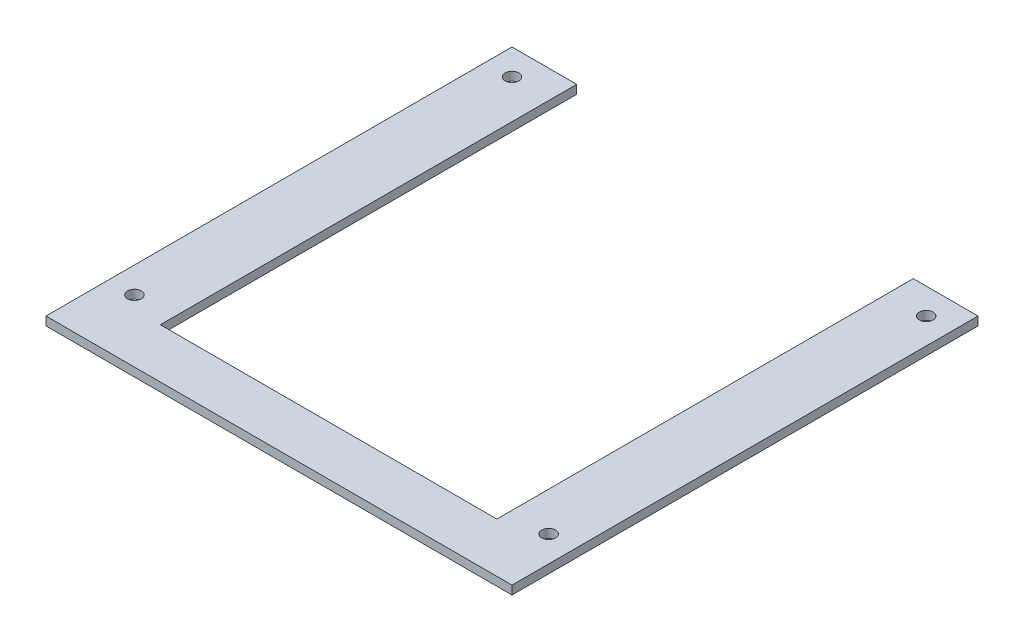
ISO-10303-21;
HEADER;
FILE_DESCRIPTION(('STEP AP214'),'2;1');
FILE_NAME('part.step','',(''),(''),'','','');
FILE_SCHEMA(('AUTOMOTIVE_DESIGN { 1 0 10303 214 1 1 1 1 }'));
ENDSEC;
DATA;
#1=APPLICATION_CONTEXT('core data for automotive mechanical design processes');
#2=APPLICATION_PROTOCOL_DEFINITION('international standard','automotive_design',2000,#1);
#3=PRODUCT_CONTEXT('',#1,'mechanical');
#4=PRODUCT('Part','Part','',(#3));
#5=PRODUCT_RELATED_PRODUCT_CATEGORY('part','',(#4));
#6=PRODUCT_DEFINITION_FORMATION('','',#4);
#7=PRODUCT_DEFINITION_CONTEXT('part definition',#1,'design');
#8=PRODUCT_DEFINITION('design','',#6,#7);
#9=PRODUCT_DEFINITION_SHAPE('','',#8);
#10=(LENGTH_UNIT() NAMED_UNIT(*) SI_UNIT(.MILLI.,.METRE.));
#11=(NAMED_UNIT(*) PLANE_ANGLE_UNIT() SI_UNIT($,.RADIAN.));
#12=(NAMED_UNIT(*) SI_UNIT($,.STERADIAN.) SOLID_ANGLE_UNIT());
#13=UNCERTAINTY_MEASURE_WITH_UNIT(LENGTH_MEASURE(1.E-05),#10,'distance_accuracy_value','');
#14=(GEOMETRIC_REPRESENTATION_CONTEXT(3) GLOBAL_UNCERTAINTY_ASSIGNED_CONTEXT((#13)) GLOBAL_UNIT_ASSIGNED_CONTEXT((#10,
#11,#12)) REPRESENTATION_CONTEXT('',''));
#15=CARTESIAN_POINT('',(0.,0.,0.));
#16=DIRECTION('',(0.,0.,1.));
#17=DIRECTION('',(1.,0.,0.));
#18=AXIS2_PLACEMENT_3D('',#15,#16,#17);
#19=CARTESIAN_POINT('',(-57.0170777988615,2.,-35.7039848197343));
#20=DIRECTION('',(0.,0.,1.));
#21=DIRECTION('',(1.,0.,0.));
#22=AXIS2_PLACEMENT_3D('',#19,#20,#21);
#23=PLANE('',#22);
#24=DIRECTION('',(-1.,0.,0.));
#25=VECTOR('',#24,1.);
#26=CARTESIAN_POINT('',(-57.0170777988615,2.,-35.7039848197343));
#27=LINE('',#26,#25);
#28=CARTESIAN_POINT('',(-42.0170777988615,2.,-35.7039848197343));
#29=VERTEX_POINT('',#28);
#30=CARTESIAN_POINT('',(-57.0170777988615,2.,-35.7039848197343));
#31=VERTEX_POINT('',#30);
#32=EDGE_CURVE('E64',#29,#31,#27,.T.);
#33=ORIENTED_EDGE('',*,*,#32,.F.);
#34=DIRECTION('',(0.,1.,0.));
#35=VECTOR('',#34,1.);
#36=CARTESIAN_POINT('',(-42.0170777988615,0.,-35.7039848197343));
#37=LINE('',#36,#35);
#38=CARTESIAN_POINT('',(-42.0170777988615,0.,-35.7039848197343));
#39=VERTEX_POINT('',#38);
#40=EDGE_CURVE('E151',#39,#29,#37,.T.);
#41=ORIENTED_EDGE('',*,*,#40,.F.);
#42=DIRECTION('',(-1.,0.,0.));
#43=VECTOR('',#42,1.);
#44=CARTESIAN_POINT('',(-57.0170777988615,0.,-35.7039848197343));
#45=LINE('',#44,#43);
#46=CARTESIAN_POINT('',(-57.0170777988615,0.,-35.7039848197343));
#47=VERTEX_POINT('',#46);
#48=EDGE_CURVE('E86',#39,#47,#45,.T.);
#49=ORIENTED_EDGE('',*,*,#48,.T.);
#50=DIRECTION('',(0.,-1.,0.));
#51=VECTOR('',#50,1.);
#52=CARTESIAN_POINT('',(-57.0170777988615,2.,-35.7039848197343));
#53=LINE('',#52,#51);
#54=EDGE_CURVE('E174',#31,#47,#53,.T.);
#55=ORIENTED_EDGE('',*,*,#54,.F.);
#56=EDGE_LOOP('',(#33,#41,#49,#55));
#57=FACE_BOUND('',#56,.T.);
#58=ADVANCED_FACE('F39',(#57),#23,.F.);
#59=CARTESIAN_POINT('',(-57.0170777988615,2.,-35.7039848197343));
#60=DIRECTION('',(1.,0.,0.));
#61=DIRECTION('',(0.,0.,-1.));
#62=AXIS2_PLACEMENT_3D('',#59,#60,#61);
#63=PLANE('',#62);
#64=DIRECTION('',(0.,0.,1.));
#65=VECTOR('',#64,1.);
#66=CARTESIAN_POINT('',(-57.0170777988615,0.,-35.7039848197343));
#67=LINE('',#66,#65);
#68=CARTESIAN_POINT('',(-57.0170777988615,0.,72.2960151802657));
#69=VERTEX_POINT('',#68);
#70=EDGE_CURVE('E154',#47,#69,#67,.T.);
#71=ORIENTED_EDGE('',*,*,#70,.T.);
#72=DIRECTION('',(0.,-1.,0.));
#73=VECTOR('',#72,1.);
#74=CARTESIAN_POINT('',(-57.0170777988615,2.,72.2960151802657));
#75=LINE('',#74,#73);
#76=CARTESIAN_POINT('',(-57.0170777988615,2.,72.2960151802657));
#77=VERTEX_POINT('',#76);
#78=EDGE_CURVE('E11',#77,#69,#75,.T.);
#79=ORIENTED_EDGE('',*,*,#78,.F.);
#80=DIRECTION('',(0.,0.,1.));
#81=VECTOR('',#80,1.);
#82=CARTESIAN_POINT('',(-57.0170777988615,2.,-35.7039848197343));
#83=LINE('',#82,#81);
#84=EDGE_CURVE('E161',#31,#77,#83,.T.);
#85=ORIENTED_EDGE('',*,*,#84,.F.);
#86=ORIENTED_EDGE('',*,*,#54,.T.);
#87=EDGE_LOOP('',(#71,#79,#85,#86));
#88=FACE_BOUND('',#87,.T.);
#89=ADVANCED_FACE('F41',(#88),#63,.F.);
#90=CARTESIAN_POINT('',(-57.0170777988615,2.,72.2960151802657));
#91=DIRECTION('',(0.,0.,-1.));
#92=DIRECTION('',(-1.,0.,0.));
#93=AXIS2_PLACEMENT_3D('',#90,#91,#92);
#94=PLANE('',#93);
#95=DIRECTION('',(1.,0.,0.));
#96=VECTOR('',#95,1.);
#97=CARTESIAN_POINT('',(-57.0170777988615,0.,72.2960151802657));
#98=LINE('',#97,#96);
#99=CARTESIAN_POINT('',(50.9829222011385,0.,72.2960151802657));
#100=VERTEX_POINT('',#99);
#101=EDGE_CURVE('E178',#69,#100,#98,.T.);
#102=ORIENTED_EDGE('',*,*,#101,.T.);
#103=DIRECTION('',(0.,-1.,0.));
#104=VECTOR('',#103,1.);
#105=CARTESIAN_POINT('',(50.9829222011385,2.,72.2960151802657));
#106=LINE('',#105,#104);
#107=CARTESIAN_POINT('',(50.9829222011385,2.,72.2960151802657));
#108=VERTEX_POINT('',#107);
#109=EDGE_CURVE('E48',#108,#100,#106,.T.);
#110=ORIENTED_EDGE('',*,*,#109,.F.);
#111=DIRECTION('',(1.,0.,0.));
#112=VECTOR('',#111,1.);
#113=CARTESIAN_POINT('',(-57.0170777988615,2.,72.2960151802657));
#114=LINE('',#113,#112);
#115=EDGE_CURVE('E93',#77,#108,#114,.T.);
#116=ORIENTED_EDGE('',*,*,#115,.F.);
#117=ORIENTED_EDGE('',*,*,#78,.T.);
#118=EDGE_LOOP('',(#102,#110,#116,#117));
#119=FACE_BOUND('',#118,.T.);
#120=ADVANCED_FACE('F208',(#119),#94,.F.);
#121=CARTESIAN_POINT('',(50.9829222011385,2.,-35.7039848197343));
#122=DIRECTION('',(-1.,0.,0.));
#123=DIRECTION('',(0.,0.,1.));
#124=AXIS2_PLACEMENT_3D('',#121,#122,#123);
#125=PLANE('',#124);
#126=DIRECTION('',(0.,0.,-1.));
#127=VECTOR('',#126,1.);
#128=CARTESIAN_POINT('',(50.9829222011385,0.,-35.7039848197343));
#129=LINE('',#128,#127);
#130=CARTESIAN_POINT('',(50.9829222011385,0.,-35.7039848197343));
#131=VERTEX_POINT('',#130);
#132=EDGE_CURVE('E181',#100,#131,#129,.T.);
#133=ORIENTED_EDGE('',*,*,#132,.T.);
#134=DIRECTION('',(0.,-1.,0.));
#135=VECTOR('',#134,1.);
#136=CARTESIAN_POINT('',(50.9829222011385,2.,-35.7039848197343));
#137=LINE('',#136,#135);
#138=CARTESIAN_POINT('',(50.9829222011385,2.,-35.7039848197343));
#139=VERTEX_POINT('',#138);
#140=EDGE_CURVE('E189',#139,#131,#137,.T.);
#141=ORIENTED_EDGE('',*,*,#140,.F.);
#142=DIRECTION('',(0.,0.,-1.));
#143=VECTOR('',#142,1.);
#144=CARTESIAN_POINT('',(50.9829222011385,2.,-35.7039848197343));
#145=LINE('',#144,#143);
#146=EDGE_CURVE('E167',#108,#139,#145,.T.);
#147=ORIENTED_EDGE('',*,*,#146,.F.);
#148=ORIENTED_EDGE('',*,*,#109,.T.);
#149=EDGE_LOOP('',(#133,#141,#147,#148));
#150=FACE_BOUND('',#149,.T.);
#151=ADVANCED_FACE('F197',(#150),#125,.F.);
#152=CARTESIAN_POINT('',(35.9829222011385,0.,-35.7039848197343));
#153=VERTEX_POINT('',#152);
#154=EDGE_CURVE('E164',#131,#153,#45,.T.);
#155=ORIENTED_EDGE('',*,*,#154,.T.);
#156=DIRECTION('',(0.,1.,0.));
#157=VECTOR('',#156,1.);
#158=CARTESIAN_POINT('',(35.9829222011385,0.,-35.7039848197343));
#159=LINE('',#158,#157);
#160=CARTESIAN_POINT('',(35.9829222011385,2.,-35.7039848197343));
#161=VERTEX_POINT('',#160);
#162=EDGE_CURVE('E155',#153,#161,#159,.T.);
#163=ORIENTED_EDGE('',*,*,#162,.T.);
#164=EDGE_CURVE('E170',#139,#161,#27,.T.);
#165=ORIENTED_EDGE('',*,*,#164,.F.);
#166=ORIENTED_EDGE('',*,*,#140,.T.);
#167=EDGE_LOOP('',(#155,#163,#165,#166));
#168=FACE_BOUND('',#167,.T.);
#169=ADVANCED_FACE('F201',(#168),#23,.F.);
#170=CARTESIAN_POINT('',(0.,2.,0.));
#171=DIRECTION('',(0.,1.,0.));
#172=DIRECTION('',(0.,0.,1.));
#173=AXIS2_PLACEMENT_3D('',#170,#171,#172);
#174=PLANE('',#173);
#175=CARTESIAN_POINT('',(44.9829222011386,2.,57.7960151802657));
#176=DIRECTION('',(0.,1.,0.));
#177=DIRECTION('',(0.,0.,1.));
#178=AXIS2_PLACEMENT_3D('',#175,#176,#177);
#179=CIRCLE('',#178,1.6);
#180=CARTESIAN_POINT('',(44.9829222011386,2.,59.3960151802657));
#181=VERTEX_POINT('',#180);
#182=EDGE_CURVE('E141',#181,#181,#179,.T.);
#183=ORIENTED_EDGE('',*,*,#182,.F.);
#184=EDGE_LOOP('',(#183));
#185=FACE_BOUND('',#184,.T.);
#186=CARTESIAN_POINT('',(-51.0170777988615,2.,57.7960151802657));
#187=DIRECTION('',(0.,1.,0.));
#188=DIRECTION('',(0.,0.,1.));
#189=AXIS2_PLACEMENT_3D('',#186,#187,#188);
#190=CIRCLE('',#189,1.6);
#191=CARTESIAN_POINT('',(-51.0170777988615,2.,59.3960151802657));
#192=VERTEX_POINT('',#191);
#193=EDGE_CURVE('E281',#192,#192,#190,.T.);
#194=ORIENTED_EDGE('',*,*,#193,.F.);
#195=EDGE_LOOP('',(#194));
#196=FACE_BOUND('',#195,.T.);
#197=CARTESIAN_POINT('',(44.9829222011386,2.,-29.7039848197343));
#198=DIRECTION('',(0.,1.,0.));
#199=DIRECTION('',(0.,0.,1.));
#200=AXIS2_PLACEMENT_3D('',#197,#198,#199);
#201=CIRCLE('',#200,1.6);
#202=CARTESIAN_POINT('',(44.9829222011386,2.,-28.1039848197343));
#203=VERTEX_POINT('',#202);
#204=EDGE_CURVE('E271',#203,#203,#201,.T.);
#205=ORIENTED_EDGE('',*,*,#204,.F.);
#206=EDGE_LOOP('',(#205));
#207=FACE_BOUND('',#206,.T.);
#208=CARTESIAN_POINT('',(-51.0170777988615,2.,-29.7039848197343));
#209=DIRECTION('',(0.,1.,0.));
#210=DIRECTION('',(0.,0.,1.));
#211=AXIS2_PLACEMENT_3D('',#208,#209,#210);
#212=CIRCLE('',#211,1.6);
#213=CARTESIAN_POINT('',(-51.0170777988615,2.,-28.1039848197343));
#214=VERTEX_POINT('',#213);
#215=EDGE_CURVE('E262',#214,#214,#212,.T.);
#216=ORIENTED_EDGE('',*,*,#215,.F.);
#217=EDGE_LOOP('',(#216));
#218=FACE_BOUND('',#217,.T.);
#219=DIRECTION('',(0.,0.,1.));
#220=VECTOR('',#219,1.);
#221=CARTESIAN_POINT('',(-42.0170777988615,2.,-35.7039848197343));
#222=LINE('',#221,#220);
#223=CARTESIAN_POINT('',(-42.0170777988615,2.,60.7960151802657));
#224=VERTEX_POINT('',#223);
#225=EDGE_CURVE('E119',#29,#224,#222,.T.);
#226=ORIENTED_EDGE('',*,*,#225,.F.);
#227=ORIENTED_EDGE('',*,*,#32,.T.);
#228=ORIENTED_EDGE('',*,*,#84,.T.);
#229=ORIENTED_EDGE('',*,*,#115,.T.);
#230=ORIENTED_EDGE('',*,*,#146,.T.);
#231=ORIENTED_EDGE('',*,*,#164,.T.);
#232=DIRECTION('',(0.,0.,-1.));
#233=VECTOR('',#232,1.);
#234=CARTESIAN_POINT('',(35.9829222011385,2.,-35.7039848197343));
#235=LINE('',#234,#233);
#236=CARTESIAN_POINT('',(35.9829222011385,2.,60.7960151802657));
#237=VERTEX_POINT('',#236);
#238=EDGE_CURVE('E135',#237,#161,#235,.T.);
#239=ORIENTED_EDGE('',*,*,#238,.F.);
#240=DIRECTION('',(1.,0.,0.));
#241=VECTOR('',#240,1.);
#242=CARTESIAN_POINT('',(-42.0170777988615,2.,60.7960151802657));
#243=LINE('',#242,#241);
#244=EDGE_CURVE('E138',#224,#237,#243,.T.);
#245=ORIENTED_EDGE('',*,*,#244,.F.);
#246=EDGE_LOOP('',(#226,#227,#228,#229,#230,#231,#239,#245));
#247=FACE_BOUND('',#246,.T.);
#248=ADVANCED_FACE('F204',(#185,#196,#207,#218,#247),#174,.T.);
#249=CARTESIAN_POINT('',(0.,0.,0.));
#250=DIRECTION('',(0.,1.,0.));
#251=DIRECTION('',(0.,0.,1.));
#252=AXIS2_PLACEMENT_3D('',#249,#250,#251);
#253=PLANE('',#252);
#254=CARTESIAN_POINT('',(44.9829222011386,0.,57.7960151802657));
#255=DIRECTION('',(0.,1.,0.));
#256=DIRECTION('',(0.,0.,1.));
#257=AXIS2_PLACEMENT_3D('',#254,#255,#256);
#258=CIRCLE('',#257,1.6);
#259=CARTESIAN_POINT('',(44.9829222011386,0.,59.3960151802657));
#260=VERTEX_POINT('',#259);
#261=EDGE_CURVE('E284',#260,#260,#258,.T.);
#262=ORIENTED_EDGE('',*,*,#261,.T.);
#263=EDGE_LOOP('',(#262));
#264=FACE_BOUND('',#263,.T.);
#265=CARTESIAN_POINT('',(-51.0170777988615,0.,57.7960151802657));
#266=DIRECTION('',(0.,1.,0.));
#267=DIRECTION('',(0.,0.,1.));
#268=AXIS2_PLACEMENT_3D('',#265,#266,#267);
#269=CIRCLE('',#268,1.6);
#270=CARTESIAN_POINT('',(-51.0170777988615,0.,59.3960151802657));
#271=VERTEX_POINT('',#270);
#272=EDGE_CURVE('E277',#271,#271,#269,.T.);
#273=ORIENTED_EDGE('',*,*,#272,.T.);
#274=EDGE_LOOP('',(#273));
#275=FACE_BOUND('',#274,.T.);
#276=CARTESIAN_POINT('',(44.9829222011386,0.,-29.7039848197343));
#277=DIRECTION('',(0.,1.,0.));
#278=DIRECTION('',(0.,0.,1.));
#279=AXIS2_PLACEMENT_3D('',#276,#277,#278);
#280=CIRCLE('',#279,1.6);
#281=CARTESIAN_POINT('',(44.9829222011386,0.,-28.1039848197343));
#282=VERTEX_POINT('',#281);
#283=EDGE_CURVE('E265',#282,#282,#280,.T.);
#284=ORIENTED_EDGE('',*,*,#283,.T.);
#285=EDGE_LOOP('',(#284));
#286=FACE_BOUND('',#285,.T.);
#287=CARTESIAN_POINT('',(-51.0170777988615,0.,-29.7039848197343));
#288=DIRECTION('',(0.,1.,0.));
#289=DIRECTION('',(0.,0.,1.));
#290=AXIS2_PLACEMENT_3D('',#287,#288,#289);
#291=CIRCLE('',#290,1.6);
#292=CARTESIAN_POINT('',(-51.0170777988615,0.,-28.1039848197343));
#293=VERTEX_POINT('',#292);
#294=EDGE_CURVE('E148',#293,#293,#291,.T.);
#295=ORIENTED_EDGE('',*,*,#294,.T.);
#296=EDGE_LOOP('',(#295));
#297=FACE_BOUND('',#296,.T.);
#298=ORIENTED_EDGE('',*,*,#48,.F.);
#299=DIRECTION('',(0.,0.,1.));
#300=VECTOR('',#299,1.);
#301=CARTESIAN_POINT('',(-42.0170777988615,0.,-35.7039848197343));
#302=LINE('',#301,#300);
#303=CARTESIAN_POINT('',(-42.0170777988615,0.,60.7960151802657));
#304=VERTEX_POINT('',#303);
#305=EDGE_CURVE('E118',#39,#304,#302,.T.);
#306=ORIENTED_EDGE('',*,*,#305,.T.);
#307=DIRECTION('',(1.,0.,0.));
#308=VECTOR('',#307,1.);
#309=CARTESIAN_POINT('',(-42.0170777988615,0.,60.7960151802657));
#310=LINE('',#309,#308);
#311=CARTESIAN_POINT('',(35.9829222011385,0.,60.7960151802657));
#312=VERTEX_POINT('',#311);
#313=EDGE_CURVE('E127',#304,#312,#310,.T.);
#314=ORIENTED_EDGE('',*,*,#313,.T.);
#315=DIRECTION('',(0.,0.,-1.));
#316=VECTOR('',#315,1.);
#317=CARTESIAN_POINT('',(35.9829222011385,0.,-35.7039848197343));
#318=LINE('',#317,#316);
#319=EDGE_CURVE('E55',#312,#153,#318,.T.);
#320=ORIENTED_EDGE('',*,*,#319,.T.);
#321=ORIENTED_EDGE('',*,*,#154,.F.);
#322=ORIENTED_EDGE('',*,*,#132,.F.);
#323=ORIENTED_EDGE('',*,*,#101,.F.);
#324=ORIENTED_EDGE('',*,*,#70,.F.);
#325=EDGE_LOOP('',(#298,#306,#314,#320,#321,#322,#323,#324));
#326=FACE_BOUND('',#325,.T.);
#327=ADVANCED_FACE('F132',(#264,#275,#286,#297,#326),#253,.F.);
#328=CARTESIAN_POINT('',(-42.0170777988615,0.,-35.7039848197343));
#329=DIRECTION('',(-1.,0.,0.));
#330=DIRECTION('',(0.,0.,1.));
#331=AXIS2_PLACEMENT_3D('',#328,#329,#330);
#332=PLANE('',#331);
#333=ORIENTED_EDGE('',*,*,#225,.T.);
#334=DIRECTION('',(0.,1.,0.));
#335=VECTOR('',#334,1.);
#336=CARTESIAN_POINT('',(-42.0170777988615,0.,60.7960151802657));
#337=LINE('',#336,#335);
#338=EDGE_CURVE('E114',#304,#224,#337,.T.);
#339=ORIENTED_EDGE('',*,*,#338,.F.);
#340=ORIENTED_EDGE('',*,*,#305,.F.);
#341=ORIENTED_EDGE('',*,*,#40,.T.);
#342=EDGE_LOOP('',(#333,#339,#340,#341));
#343=FACE_BOUND('',#342,.T.);
#344=ADVANCED_FACE('F116',(#343),#332,.F.);
#345=CARTESIAN_POINT('',(35.9829222011385,0.,-35.7039848197343));
#346=DIRECTION('',(1.,0.,0.));
#347=DIRECTION('',(0.,0.,-1.));
#348=AXIS2_PLACEMENT_3D('',#345,#346,#347);
#349=PLANE('',#348);
#350=ORIENTED_EDGE('',*,*,#238,.T.);
#351=ORIENTED_EDGE('',*,*,#162,.F.);
#352=ORIENTED_EDGE('',*,*,#319,.F.);
#353=DIRECTION('',(0.,1.,0.));
#354=VECTOR('',#353,1.);
#355=CARTESIAN_POINT('',(35.9829222011385,0.,60.7960151802657));
#356=LINE('',#355,#354);
#357=EDGE_CURVE('E124',#312,#237,#356,.T.);
#358=ORIENTED_EDGE('',*,*,#357,.T.);
#359=EDGE_LOOP('',(#350,#351,#352,#358));
#360=FACE_BOUND('',#359,.T.);
#361=ADVANCED_FACE('F235',(#360),#349,.F.);
#362=CARTESIAN_POINT('',(-42.0170777988615,0.,60.7960151802657));
#363=DIRECTION('',(0.,0.,1.));
#364=DIRECTION('',(1.,0.,0.));
#365=AXIS2_PLACEMENT_3D('',#362,#363,#364);
#366=PLANE('',#365);
#367=ORIENTED_EDGE('',*,*,#244,.T.);
#368=ORIENTED_EDGE('',*,*,#357,.F.);
#369=ORIENTED_EDGE('',*,*,#313,.F.);
#370=ORIENTED_EDGE('',*,*,#338,.T.);
#371=EDGE_LOOP('',(#367,#368,#369,#370));
#372=FACE_BOUND('',#371,.T.);
#373=ADVANCED_FACE('F128',(#372),#366,.F.);
#374=CARTESIAN_POINT('',(-51.0170777988615,0.,-29.7039848197343));
#375=DIRECTION('',(0.,1.,0.));
#376=DIRECTION('',(0.,0.,1.));
#377=AXIS2_PLACEMENT_3D('',#374,#375,#376);
#378=CYLINDRICAL_SURFACE('',#377,1.6);
#379=ORIENTED_EDGE('',*,*,#294,.F.);
#380=EDGE_LOOP('',(#379));
#381=FACE_BOUND('',#380,.T.);
#382=ORIENTED_EDGE('',*,*,#215,.T.);
#383=EDGE_LOOP('',(#382));
#384=FACE_BOUND('',#383,.T.);
#385=ADVANCED_FACE('F238',(#381,#384),#378,.F.);
#386=CARTESIAN_POINT('',(44.9829222011386,0.,-29.7039848197343));
#387=DIRECTION('',(0.,1.,0.));
#388=DIRECTION('',(0.,0.,1.));
#389=AXIS2_PLACEMENT_3D('',#386,#387,#388);
#390=CYLINDRICAL_SURFACE('',#389,1.6);
#391=ORIENTED_EDGE('',*,*,#283,.F.);
#392=EDGE_LOOP('',(#391));
#393=FACE_BOUND('',#392,.T.);
#394=ORIENTED_EDGE('',*,*,#204,.T.);
#395=EDGE_LOOP('',(#394));
#396=FACE_BOUND('',#395,.T.);
#397=ADVANCED_FACE('F248',(#393,#396),#390,.F.);
#398=CARTESIAN_POINT('',(-51.0170777988615,0.,57.7960151802657));
#399=DIRECTION('',(0.,1.,0.));
#400=DIRECTION('',(0.,0.,1.));
#401=AXIS2_PLACEMENT_3D('',#398,#399,#400);
#402=CYLINDRICAL_SURFACE('',#401,1.6);
#403=ORIENTED_EDGE('',*,*,#272,.F.);
#404=EDGE_LOOP('',(#403));
#405=FACE_BOUND('',#404,.T.);
#406=ORIENTED_EDGE('',*,*,#193,.T.);
#407=EDGE_LOOP('',(#406));
#408=FACE_BOUND('',#407,.T.);
#409=ADVANCED_FACE('F244',(#405,#408),#402,.F.);
#410=CARTESIAN_POINT('',(44.9829222011386,0.,57.7960151802657));
#411=DIRECTION('',(0.,1.,0.));
#412=DIRECTION('',(0.,0.,1.));
#413=AXIS2_PLACEMENT_3D('',#410,#411,#412);
#414=CYLINDRICAL_SURFACE('',#413,1.6);
#415=ORIENTED_EDGE('',*,*,#261,.F.);
#416=EDGE_LOOP('',(#415));
#417=FACE_BOUND('',#416,.T.);
#418=ORIENTED_EDGE('',*,*,#182,.T.);
#419=EDGE_LOOP('',(#418));
#420=FACE_BOUND('',#419,.T.);
#421=ADVANCED_FACE('F241',(#417,#420),#414,.F.);
#422=CLOSED_SHELL('',(#58,#89,#120,#151,#169,#248,#327,#344,#361,#373,#385,#397,#409,#421));
#423=MANIFOLD_SOLID_BREP('B2',#422);
#424=ADVANCED_BREP_SHAPE_REPRESENTATION('',(#18,#423),#14);
#425=SHAPE_DEFINITION_REPRESENTATION(#9,#424);
ENDSEC;
END-ISO-10303-21;
